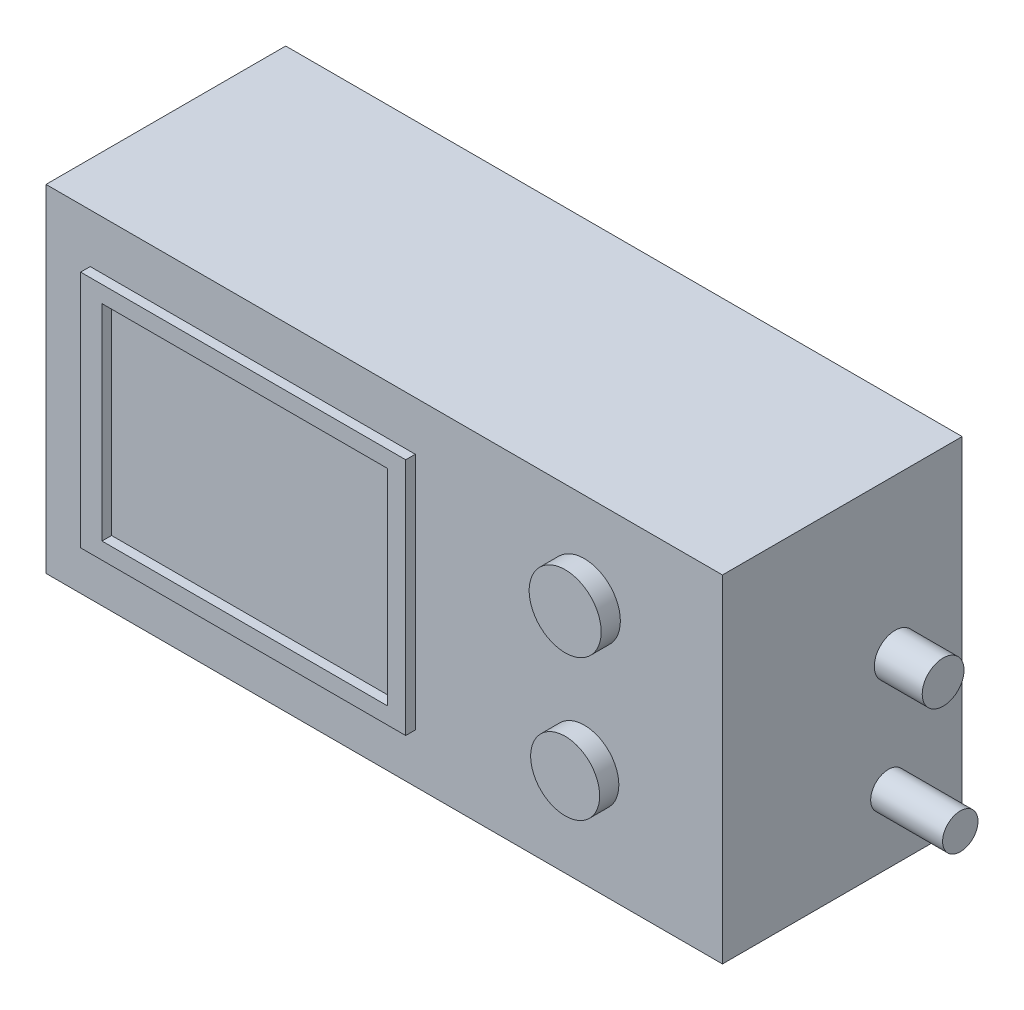
ISO-10303-21;
HEADER;
FILE_DESCRIPTION(('STEP AP214'),'2;1');
FILE_NAME('part.step','',(''),(''),'','','');
FILE_SCHEMA(('AUTOMOTIVE_DESIGN { 1 0 10303 214 1 1 1 1 }'));
ENDSEC;
DATA;
#1=APPLICATION_CONTEXT('core data for automotive mechanical design processes');
#2=APPLICATION_PROTOCOL_DEFINITION('international standard','automotive_design',2000,#1);
#3=PRODUCT_CONTEXT('',#1,'mechanical');
#4=PRODUCT('Part','Part','',(#3));
#5=PRODUCT_RELATED_PRODUCT_CATEGORY('part','',(#4));
#6=PRODUCT_DEFINITION_FORMATION('','',#4);
#7=PRODUCT_DEFINITION_CONTEXT('part definition',#1,'design');
#8=PRODUCT_DEFINITION('design','',#6,#7);
#9=PRODUCT_DEFINITION_SHAPE('','',#8);
#10=(LENGTH_UNIT() NAMED_UNIT(*) SI_UNIT(.MILLI.,.METRE.));
#11=(NAMED_UNIT(*) PLANE_ANGLE_UNIT() SI_UNIT($,.RADIAN.));
#12=(NAMED_UNIT(*) SI_UNIT($,.STERADIAN.) SOLID_ANGLE_UNIT());
#13=UNCERTAINTY_MEASURE_WITH_UNIT(LENGTH_MEASURE(1.E-05),#10,'distance_accuracy_value','');
#14=(GEOMETRIC_REPRESENTATION_CONTEXT(3) GLOBAL_UNCERTAINTY_ASSIGNED_CONTEXT((#13)) GLOBAL_UNIT_ASSIGNED_CONTEXT((#10,
#11,#12)) REPRESENTATION_CONTEXT('',''));
#15=CARTESIAN_POINT('',(0.,0.,0.));
#16=DIRECTION('',(0.,0.,1.));
#17=DIRECTION('',(1.,0.,0.));
#18=AXIS2_PLACEMENT_3D('',#15,#16,#17);
#19=CARTESIAN_POINT('',(0.,0.,50.));
#20=DIRECTION('',(0.,0.,1.));
#21=DIRECTION('',(1.,0.,0.));
#22=AXIS2_PLACEMENT_3D('',#19,#20,#21);
#23=PLANE('',#22);
#24=CARTESIAN_POINT('',(41.7432358237519,-13.5922837915246,50.));
#25=DIRECTION('',(0.,0.,1.));
#26=DIRECTION('',(1.,0.,0.));
#27=AXIS2_PLACEMENT_3D('',#24,#25,#26);
#28=CIRCLE('',#27,7.19474819268916);
#29=CARTESIAN_POINT('',(48.9379840164411,-13.5922837915246,50.));
#30=VERTEX_POINT('',#29);
#31=EDGE_CURVE('E449',#30,#30,#28,.T.);
#32=ORIENTED_EDGE('',*,*,#31,.F.);
#33=EDGE_LOOP('',(#32));
#34=FACE_BOUND('',#33,.T.);
#35=CARTESIAN_POINT('',(41.7432358237519,16.1796573708699,50.));
#36=DIRECTION('',(0.,0.,1.));
#37=DIRECTION('',(1.,0.,0.));
#38=AXIS2_PLACEMENT_3D('',#35,#36,#37);
#39=CIRCLE('',#38,7.50966636979589);
#40=CARTESIAN_POINT('',(49.2529021935478,16.1796573708699,50.));
#41=VERTEX_POINT('',#40);
#42=EDGE_CURVE('E455',#41,#41,#39,.T.);
#43=ORIENTED_EDGE('',*,*,#42,.F.);
#44=EDGE_LOOP('',(#43));
#45=FACE_BOUND('',#44,.T.);
#46=DIRECTION('',(0.,1.,0.));
#47=VECTOR('',#46,1.);
#48=CARTESIAN_POINT('',(70.552248215904,35.1395605691778,50.));
#49=LINE('',#48,#47);
#50=CARTESIAN_POINT('',(70.552248215904,-35.1395605691778,50.));
#51=VERTEX_POINT('',#50);
#52=CARTESIAN_POINT('',(70.552248215904,35.1395605691778,50.));
#53=VERTEX_POINT('',#52);
#54=EDGE_CURVE('E192',#51,#53,#49,.T.);
#55=ORIENTED_EDGE('',*,*,#54,.T.);
#56=DIRECTION('',(-1.,0.,0.));
#57=VECTOR('',#56,1.);
#58=CARTESIAN_POINT('',(-70.552248215904,35.1395605691778,50.));
#59=LINE('',#58,#57);
#60=CARTESIAN_POINT('',(-70.552248215904,35.1395605691778,50.));
#61=VERTEX_POINT('',#60);
#62=EDGE_CURVE('E195',#53,#61,#59,.T.);
#63=ORIENTED_EDGE('',*,*,#62,.T.);
#64=DIRECTION('',(0.,-1.,0.));
#65=VECTOR('',#64,1.);
#66=CARTESIAN_POINT('',(-70.552248215904,35.1395605691778,50.));
#67=LINE('',#66,#65);
#68=CARTESIAN_POINT('',(-70.552248215904,-35.1395605691778,50.));
#69=VERTEX_POINT('',#68);
#70=EDGE_CURVE('E198',#61,#69,#67,.T.);
#71=ORIENTED_EDGE('',*,*,#70,.T.);
#72=DIRECTION('',(1.,0.,0.));
#73=VECTOR('',#72,1.);
#74=CARTESIAN_POINT('',(-70.552248215904,-35.1395605691778,50.));
#75=LINE('',#74,#73);
#76=EDGE_CURVE('E200',#69,#51,#75,.T.);
#77=ORIENTED_EDGE('',*,*,#76,.T.);
#78=EDGE_LOOP('',(#55,#63,#71,#77));
#79=FACE_BOUND('',#78,.T.);
#80=DIRECTION('',(-1.,0.,0.));
#81=VECTOR('',#80,1.);
#82=CARTESIAN_POINT('',(-61.3307429758327,24.9076398150599,50.));
#83=LINE('',#82,#81);
#84=CARTESIAN_POINT('',(6.47482514606424,24.9076398150599,50.));
#85=VERTEX_POINT('',#84);
#86=CARTESIAN_POINT('',(-61.3307429758327,24.9076398150599,50.));
#87=VERTEX_POINT('',#86);
#88=EDGE_CURVE('E178',#85,#87,#83,.T.);
#89=ORIENTED_EDGE('',*,*,#88,.F.);
#90=DIRECTION('',(0.,1.,0.));
#91=VECTOR('',#90,1.);
#92=CARTESIAN_POINT('',(6.47482514606424,24.9076398150599,50.));
#93=LINE('',#92,#91);
#94=CARTESIAN_POINT('',(6.47482514606423,-24.9076398150599,50.));
#95=VERTEX_POINT('',#94);
#96=EDGE_CURVE('E141',#95,#85,#93,.T.);
#97=ORIENTED_EDGE('',*,*,#96,.F.);
#98=DIRECTION('',(1.,0.,0.));
#99=VECTOR('',#98,1.);
#100=CARTESIAN_POINT('',(-61.3307429758327,-24.9076398150599,50.));
#101=LINE('',#100,#99);
#102=CARTESIAN_POINT('',(-61.3307429758327,-24.9076398150599,50.));
#103=VERTEX_POINT('',#102);
#104=EDGE_CURVE('E169',#103,#95,#101,.T.);
#105=ORIENTED_EDGE('',*,*,#104,.F.);
#106=DIRECTION('',(0.,-1.,0.));
#107=VECTOR('',#106,1.);
#108=CARTESIAN_POINT('',(-61.3307429758327,24.9076398150599,50.));
#109=LINE('',#108,#107);
#110=EDGE_CURVE('E180',#87,#103,#109,.T.);
#111=ORIENTED_EDGE('',*,*,#110,.F.);
#112=EDGE_LOOP('',(#89,#97,#105,#111));
#113=FACE_BOUND('',#112,.T.);
#114=ADVANCED_FACE('F33',(#34,#45,#79,#113),#23,.T.);
#115=CARTESIAN_POINT('',(70.552248215904,35.1395605691778,50.));
#116=DIRECTION('',(-1.,0.,0.));
#117=DIRECTION('',(0.,0.,1.));
#118=AXIS2_PLACEMENT_3D('',#115,#116,#117);
#119=PLANE('',#118);
#120=CARTESIAN_POINT('',(70.552248215904,-20.9817019145522,15.3903178338375));
#121=DIRECTION('',(-1.,0.,0.));
#122=DIRECTION('',(0.,0.,1.));
#123=AXIS2_PLACEMENT_3D('',#120,#121,#122);
#124=CIRCLE('',#123,3.69367417620855);
#125=CARTESIAN_POINT('',(70.552248215904,-20.9817019145522,19.083992010046));
#126=VERTEX_POINT('',#125);
#127=EDGE_CURVE('E11',#126,#126,#124,.F.);
#128=ORIENTED_EDGE('',*,*,#127,.F.);
#129=EDGE_LOOP('',(#128));
#130=FACE_BOUND('',#129,.T.);
#131=CARTESIAN_POINT('',(70.552248215904,2.76951532955394,13.9697879538403));
#132=DIRECTION('',(-1.,0.,0.));
#133=DIRECTION('',(0.,0.,1.));
#134=AXIS2_PLACEMENT_3D('',#131,#132,#133);
#135=CIRCLE('',#134,4.36456916822436);
#136=CARTESIAN_POINT('',(70.552248215904,2.76951532955394,18.3343571220647));
#137=VERTEX_POINT('',#136);
#138=EDGE_CURVE('E41',#137,#137,#135,.F.);
#139=ORIENTED_EDGE('',*,*,#138,.F.);
#140=EDGE_LOOP('',(#139));
#141=FACE_BOUND('',#140,.T.);
#142=DIRECTION('',(0.,1.,0.));
#143=VECTOR('',#142,1.);
#144=CARTESIAN_POINT('',(70.552248215904,35.1395605691778,0.));
#145=LINE('',#144,#143);
#146=CARTESIAN_POINT('',(70.552248215904,-35.1395605691778,0.));
#147=VERTEX_POINT('',#146);
#148=CARTESIAN_POINT('',(70.552248215904,35.1395605691778,0.));
#149=VERTEX_POINT('',#148);
#150=EDGE_CURVE('E191',#147,#149,#145,.T.);
#151=ORIENTED_EDGE('',*,*,#150,.T.);
#152=DIRECTION('',(0.,0.,-1.));
#153=VECTOR('',#152,1.);
#154=CARTESIAN_POINT('',(70.552248215904,35.1395605691778,50.));
#155=LINE('',#154,#153);
#156=EDGE_CURVE('E218',#53,#149,#155,.T.);
#157=ORIENTED_EDGE('',*,*,#156,.F.);
#158=ORIENTED_EDGE('',*,*,#54,.F.);
#159=DIRECTION('',(0.,0.,-1.));
#160=VECTOR('',#159,1.);
#161=CARTESIAN_POINT('',(70.552248215904,-35.1395605691778,50.));
#162=LINE('',#161,#160);
#163=EDGE_CURVE('E202',#51,#147,#162,.T.);
#164=ORIENTED_EDGE('',*,*,#163,.T.);
#165=EDGE_LOOP('',(#151,#157,#158,#164));
#166=FACE_BOUND('',#165,.T.);
#167=ADVANCED_FACE('F35',(#130,#141,#166),#119,.F.);
#168=CARTESIAN_POINT('',(-70.552248215904,35.1395605691778,50.));
#169=DIRECTION('',(0.,-1.,0.));
#170=DIRECTION('',(0.,0.,-1.));
#171=AXIS2_PLACEMENT_3D('',#168,#169,#170);
#172=PLANE('',#171);
#173=DIRECTION('',(-1.,0.,0.));
#174=VECTOR('',#173,1.);
#175=CARTESIAN_POINT('',(-70.552248215904,35.1395605691778,0.));
#176=LINE('',#175,#174);
#177=CARTESIAN_POINT('',(-70.552248215904,35.1395605691778,0.));
#178=VERTEX_POINT('',#177);
#179=EDGE_CURVE('E205',#149,#178,#176,.T.);
#180=ORIENTED_EDGE('',*,*,#179,.T.);
#181=DIRECTION('',(0.,0.,-1.));
#182=VECTOR('',#181,1.);
#183=CARTESIAN_POINT('',(-70.552248215904,35.1395605691778,50.));
#184=LINE('',#183,#182);
#185=EDGE_CURVE('E215',#61,#178,#184,.T.);
#186=ORIENTED_EDGE('',*,*,#185,.F.);
#187=ORIENTED_EDGE('',*,*,#62,.F.);
#188=ORIENTED_EDGE('',*,*,#156,.T.);
#189=EDGE_LOOP('',(#180,#186,#187,#188));
#190=FACE_BOUND('',#189,.T.);
#191=ADVANCED_FACE('F227',(#190),#172,.F.);
#192=CARTESIAN_POINT('',(-70.552248215904,35.1395605691778,50.));
#193=DIRECTION('',(1.,0.,0.));
#194=DIRECTION('',(0.,0.,-1.));
#195=AXIS2_PLACEMENT_3D('',#192,#193,#194);
#196=PLANE('',#195);
#197=DIRECTION('',(0.,-1.,0.));
#198=VECTOR('',#197,1.);
#199=CARTESIAN_POINT('',(-70.552248215904,35.1395605691778,0.));
#200=LINE('',#199,#198);
#201=CARTESIAN_POINT('',(-70.552248215904,-35.1395605691778,0.));
#202=VERTEX_POINT('',#201);
#203=EDGE_CURVE('E207',#178,#202,#200,.T.);
#204=ORIENTED_EDGE('',*,*,#203,.T.);
#205=DIRECTION('',(0.,0.,-1.));
#206=VECTOR('',#205,1.);
#207=CARTESIAN_POINT('',(-70.552248215904,-35.1395605691778,50.));
#208=LINE('',#207,#206);
#209=EDGE_CURVE('E212',#69,#202,#208,.T.);
#210=ORIENTED_EDGE('',*,*,#209,.F.);
#211=ORIENTED_EDGE('',*,*,#70,.F.);
#212=ORIENTED_EDGE('',*,*,#185,.T.);
#213=EDGE_LOOP('',(#204,#210,#211,#212));
#214=FACE_BOUND('',#213,.T.);
#215=ADVANCED_FACE('F247',(#214),#196,.F.);
#216=CARTESIAN_POINT('',(-70.552248215904,-35.1395605691778,50.));
#217=DIRECTION('',(0.,1.,0.));
#218=DIRECTION('',(0.,0.,1.));
#219=AXIS2_PLACEMENT_3D('',#216,#217,#218);
#220=PLANE('',#219);
#221=DIRECTION('',(1.,0.,0.));
#222=VECTOR('',#221,1.);
#223=CARTESIAN_POINT('',(-70.552248215904,-35.1395605691778,0.));
#224=LINE('',#223,#222);
#225=EDGE_CURVE('E196',#202,#147,#224,.T.);
#226=ORIENTED_EDGE('',*,*,#225,.T.);
#227=ORIENTED_EDGE('',*,*,#163,.F.);
#228=ORIENTED_EDGE('',*,*,#76,.F.);
#229=ORIENTED_EDGE('',*,*,#209,.T.);
#230=EDGE_LOOP('',(#226,#227,#228,#229));
#231=FACE_BOUND('',#230,.T.);
#232=ADVANCED_FACE('F245',(#231),#220,.F.);
#233=CARTESIAN_POINT('',(0.,0.,0.));
#234=DIRECTION('',(0.,0.,1.));
#235=DIRECTION('',(1.,0.,0.));
#236=AXIS2_PLACEMENT_3D('',#233,#234,#235);
#237=PLANE('',#236);
#238=ORIENTED_EDGE('',*,*,#150,.F.);
#239=ORIENTED_EDGE('',*,*,#225,.F.);
#240=ORIENTED_EDGE('',*,*,#203,.F.);
#241=ORIENTED_EDGE('',*,*,#179,.F.);
#242=EDGE_LOOP('',(#238,#239,#240,#241));
#243=FACE_BOUND('',#242,.T.);
#244=ADVANCED_FACE('F235',(#243),#237,.F.);
#245=CARTESIAN_POINT('',(0.,0.,52.));
#246=DIRECTION('',(0.,0.,1.));
#247=DIRECTION('',(1.,0.,0.));
#248=AXIS2_PLACEMENT_3D('',#245,#246,#247);
#249=PLANE('',#248);
#250=DIRECTION('',(0.,1.,0.));
#251=VECTOR('',#250,1.);
#252=CARTESIAN_POINT('',(6.47482514606424,24.9076398150599,52.));
#253=LINE('',#252,#251);
#254=CARTESIAN_POINT('',(6.47482514606423,-24.9076398150599,52.));
#255=VERTEX_POINT('',#254);
#256=CARTESIAN_POINT('',(6.47482514606424,24.9076398150599,52.));
#257=VERTEX_POINT('',#256);
#258=EDGE_CURVE('E165',#255,#257,#253,.T.);
#259=ORIENTED_EDGE('',*,*,#258,.T.);
#260=DIRECTION('',(-1.,0.,0.));
#261=VECTOR('',#260,1.);
#262=CARTESIAN_POINT('',(-61.3307429758327,24.9076398150599,52.));
#263=LINE('',#262,#261);
#264=CARTESIAN_POINT('',(-61.3307429758327,24.9076398150599,52.));
#265=VERTEX_POINT('',#264);
#266=EDGE_CURVE('E168',#257,#265,#263,.T.);
#267=ORIENTED_EDGE('',*,*,#266,.T.);
#268=DIRECTION('',(0.,-1.,0.));
#269=VECTOR('',#268,1.);
#270=CARTESIAN_POINT('',(-61.3307429758327,24.9076398150599,52.));
#271=LINE('',#270,#269);
#272=CARTESIAN_POINT('',(-61.3307429758327,-24.9076398150599,52.));
#273=VERTEX_POINT('',#272);
#274=EDGE_CURVE('E171',#265,#273,#271,.T.);
#275=ORIENTED_EDGE('',*,*,#274,.T.);
#276=DIRECTION('',(1.,0.,0.));
#277=VECTOR('',#276,1.);
#278=CARTESIAN_POINT('',(-61.3307429758327,-24.9076398150599,52.));
#279=LINE('',#278,#277);
#280=EDGE_CURVE('E173',#273,#255,#279,.T.);
#281=ORIENTED_EDGE('',*,*,#280,.T.);
#282=EDGE_LOOP('',(#259,#267,#275,#281));
#283=FACE_BOUND('',#282,.T.);
#284=DIRECTION('',(-1.,0.,0.));
#285=VECTOR('',#284,1.);
#286=CARTESIAN_POINT('',(-56.8743135997209,21.4471433925496,52.));
#287=LINE('',#286,#285);
#288=CARTESIAN_POINT('',(2.718580593708,21.4471433925496,52.));
#289=VERTEX_POINT('',#288);
#290=CARTESIAN_POINT('',(-56.8743135997209,21.4471433925496,52.));
#291=VERTEX_POINT('',#290);
#292=EDGE_CURVE('E133',#289,#291,#287,.T.);
#293=ORIENTED_EDGE('',*,*,#292,.F.);
#294=DIRECTION('',(0.,1.,0.));
#295=VECTOR('',#294,1.);
#296=CARTESIAN_POINT('',(2.718580593708,21.4471433925496,52.));
#297=LINE('',#296,#295);
#298=CARTESIAN_POINT('',(2.718580593708,-21.4471433925496,52.));
#299=VERTEX_POINT('',#298);
#300=EDGE_CURVE('E124',#299,#289,#297,.T.);
#301=ORIENTED_EDGE('',*,*,#300,.F.);
#302=DIRECTION('',(1.,0.,0.));
#303=VECTOR('',#302,1.);
#304=CARTESIAN_POINT('',(-56.8743135997209,-21.4471433925496,52.));
#305=LINE('',#304,#303);
#306=CARTESIAN_POINT('',(-56.8743135997209,-21.4471433925496,52.));
#307=VERTEX_POINT('',#306);
#308=EDGE_CURVE('E149',#307,#299,#305,.T.);
#309=ORIENTED_EDGE('',*,*,#308,.F.);
#310=DIRECTION('',(0.,-1.,0.));
#311=VECTOR('',#310,1.);
#312=CARTESIAN_POINT('',(-56.8743135997209,21.4471433925496,52.));
#313=LINE('',#312,#311);
#314=EDGE_CURVE('E147',#291,#307,#313,.T.);
#315=ORIENTED_EDGE('',*,*,#314,.F.);
#316=EDGE_LOOP('',(#293,#301,#309,#315));
#317=FACE_BOUND('',#316,.T.);
#318=ADVANCED_FACE('F145',(#283,#317),#249,.T.);
#319=CARTESIAN_POINT('',(6.47482514606424,24.9076398150599,52.));
#320=DIRECTION('',(-1.,0.,0.));
#321=DIRECTION('',(0.,-1.,0.));
#322=AXIS2_PLACEMENT_3D('',#319,#320,#321);
#323=PLANE('',#322);
#324=ORIENTED_EDGE('',*,*,#96,.T.);
#325=DIRECTION('',(0.,0.,-1.));
#326=VECTOR('',#325,1.);
#327=CARTESIAN_POINT('',(6.47482514606424,24.9076398150599,52.));
#328=LINE('',#327,#326);
#329=EDGE_CURVE('E189',#257,#85,#328,.T.);
#330=ORIENTED_EDGE('',*,*,#329,.F.);
#331=ORIENTED_EDGE('',*,*,#258,.F.);
#332=DIRECTION('',(0.,0.,-1.));
#333=VECTOR('',#332,1.);
#334=CARTESIAN_POINT('',(6.47482514606423,-24.9076398150599,52.));
#335=LINE('',#334,#333);
#336=EDGE_CURVE('E175',#255,#95,#335,.T.);
#337=ORIENTED_EDGE('',*,*,#336,.T.);
#338=EDGE_LOOP('',(#324,#330,#331,#337));
#339=FACE_BOUND('',#338,.T.);
#340=ADVANCED_FACE('F293',(#339),#323,.F.);
#341=CARTESIAN_POINT('',(-61.3307429758327,24.9076398150599,52.));
#342=DIRECTION('',(0.,-1.,0.));
#343=DIRECTION('',(0.,0.,-1.));
#344=AXIS2_PLACEMENT_3D('',#341,#342,#343);
#345=PLANE('',#344);
#346=ORIENTED_EDGE('',*,*,#88,.T.);
#347=DIRECTION('',(0.,0.,-1.));
#348=VECTOR('',#347,1.);
#349=CARTESIAN_POINT('',(-61.3307429758327,24.9076398150599,52.));
#350=LINE('',#349,#348);
#351=EDGE_CURVE('E186',#265,#87,#350,.T.);
#352=ORIENTED_EDGE('',*,*,#351,.F.);
#353=ORIENTED_EDGE('',*,*,#266,.F.);
#354=ORIENTED_EDGE('',*,*,#329,.T.);
#355=EDGE_LOOP('',(#346,#352,#353,#354));
#356=FACE_BOUND('',#355,.T.);
#357=ADVANCED_FACE('F300',(#356),#345,.F.);
#358=CARTESIAN_POINT('',(-61.3307429758327,24.9076398150599,52.));
#359=DIRECTION('',(1.,0.,0.));
#360=DIRECTION('',(0.,1.,0.));
#361=AXIS2_PLACEMENT_3D('',#358,#359,#360);
#362=PLANE('',#361);
#363=ORIENTED_EDGE('',*,*,#110,.T.);
#364=DIRECTION('',(0.,0.,-1.));
#365=VECTOR('',#364,1.);
#366=CARTESIAN_POINT('',(-61.3307429758327,-24.9076398150599,52.));
#367=LINE('',#366,#365);
#368=EDGE_CURVE('E48',#273,#103,#367,.T.);
#369=ORIENTED_EDGE('',*,*,#368,.F.);
#370=ORIENTED_EDGE('',*,*,#274,.F.);
#371=ORIENTED_EDGE('',*,*,#351,.T.);
#372=EDGE_LOOP('',(#363,#369,#370,#371));
#373=FACE_BOUND('',#372,.T.);
#374=ADVANCED_FACE('F297',(#373),#362,.F.);
#375=CARTESIAN_POINT('',(-61.3307429758327,-24.9076398150599,52.));
#376=DIRECTION('',(0.,1.,0.));
#377=DIRECTION('',(-1.,0.,0.));
#378=AXIS2_PLACEMENT_3D('',#375,#376,#377);
#379=PLANE('',#378);
#380=ORIENTED_EDGE('',*,*,#104,.T.);
#381=ORIENTED_EDGE('',*,*,#336,.F.);
#382=ORIENTED_EDGE('',*,*,#280,.F.);
#383=ORIENTED_EDGE('',*,*,#368,.T.);
#384=EDGE_LOOP('',(#380,#381,#382,#383));
#385=FACE_BOUND('',#384,.T.);
#386=ADVANCED_FACE('F290',(#385),#379,.F.);
#387=CARTESIAN_POINT('',(2.718580593708,21.4471433925496,52.));
#388=DIRECTION('',(-1.,0.,0.));
#389=DIRECTION('',(0.,-1.,0.));
#390=AXIS2_PLACEMENT_3D('',#387,#388,#389);
#391=PLANE('',#390);
#392=DIRECTION('',(0.,1.,0.));
#393=VECTOR('',#392,1.);
#394=CARTESIAN_POINT('',(2.718580593708,21.4471433925496,50.));
#395=LINE('',#394,#393);
#396=CARTESIAN_POINT('',(2.718580593708,-21.4471433925496,50.));
#397=VERTEX_POINT('',#396);
#398=CARTESIAN_POINT('',(2.718580593708,21.4471433925496,50.));
#399=VERTEX_POINT('',#398);
#400=EDGE_CURVE('E56',#397,#399,#395,.T.);
#401=ORIENTED_EDGE('',*,*,#400,.F.);
#402=DIRECTION('',(0.,0.,-1.));
#403=VECTOR('',#402,1.);
#404=CARTESIAN_POINT('',(2.718580593708,-21.4471433925496,52.));
#405=LINE('',#404,#403);
#406=EDGE_CURVE('E129',#299,#397,#405,.T.);
#407=ORIENTED_EDGE('',*,*,#406,.F.);
#408=ORIENTED_EDGE('',*,*,#300,.T.);
#409=DIRECTION('',(0.,0.,-1.));
#410=VECTOR('',#409,1.);
#411=CARTESIAN_POINT('',(2.718580593708,21.4471433925496,52.));
#412=LINE('',#411,#410);
#413=EDGE_CURVE('E127',#289,#399,#412,.T.);
#414=ORIENTED_EDGE('',*,*,#413,.T.);
#415=EDGE_LOOP('',(#401,#407,#408,#414));
#416=FACE_BOUND('',#415,.T.);
#417=ADVANCED_FACE('F126',(#416),#391,.T.);
#418=CARTESIAN_POINT('',(-56.8743135997209,21.4471433925496,52.));
#419=DIRECTION('',(0.,-1.,0.));
#420=DIRECTION('',(0.,0.,-1.));
#421=AXIS2_PLACEMENT_3D('',#418,#419,#420);
#422=PLANE('',#421);
#423=DIRECTION('',(-1.,0.,0.));
#424=VECTOR('',#423,1.);
#425=CARTESIAN_POINT('',(-56.8743135997209,21.4471433925496,50.));
#426=LINE('',#425,#424);
#427=CARTESIAN_POINT('',(-56.874313599721,21.4471433925496,50.));
#428=VERTEX_POINT('',#427);
#429=EDGE_CURVE('E140',#399,#428,#426,.T.);
#430=ORIENTED_EDGE('',*,*,#429,.F.);
#431=ORIENTED_EDGE('',*,*,#413,.F.);
#432=ORIENTED_EDGE('',*,*,#292,.T.);
#433=DIRECTION('',(0.,0.,-1.));
#434=VECTOR('',#433,1.);
#435=CARTESIAN_POINT('',(-56.8743135997209,21.4471433925496,52.));
#436=LINE('',#435,#434);
#437=EDGE_CURVE('E142',#291,#428,#436,.T.);
#438=ORIENTED_EDGE('',*,*,#437,.T.);
#439=EDGE_LOOP('',(#430,#431,#432,#438));
#440=FACE_BOUND('',#439,.T.);
#441=ADVANCED_FACE('F137',(#440),#422,.T.);
#442=CARTESIAN_POINT('',(-56.8743135997209,21.4471433925496,52.));
#443=DIRECTION('',(1.,0.,0.));
#444=DIRECTION('',(0.,1.,0.));
#445=AXIS2_PLACEMENT_3D('',#442,#443,#444);
#446=PLANE('',#445);
#447=DIRECTION('',(0.,-1.,0.));
#448=VECTOR('',#447,1.);
#449=CARTESIAN_POINT('',(-56.8743135997209,21.4471433925496,50.));
#450=LINE('',#449,#448);
#451=CARTESIAN_POINT('',(-56.8743135997209,-21.4471433925496,50.));
#452=VERTEX_POINT('',#451);
#453=EDGE_CURVE('E157',#428,#452,#450,.T.);
#454=ORIENTED_EDGE('',*,*,#453,.F.);
#455=ORIENTED_EDGE('',*,*,#437,.F.);
#456=ORIENTED_EDGE('',*,*,#314,.T.);
#457=DIRECTION('',(0.,0.,-1.));
#458=VECTOR('',#457,1.);
#459=CARTESIAN_POINT('',(-56.8743135997209,-21.4471433925496,52.));
#460=LINE('',#459,#458);
#461=EDGE_CURVE('E161',#307,#452,#460,.T.);
#462=ORIENTED_EDGE('',*,*,#461,.T.);
#463=EDGE_LOOP('',(#454,#455,#456,#462));
#464=FACE_BOUND('',#463,.T.);
#465=ADVANCED_FACE('F275',(#464),#446,.T.);
#466=CARTESIAN_POINT('',(-56.8743135997209,-21.4471433925496,52.));
#467=DIRECTION('',(0.,1.,0.));
#468=DIRECTION('',(0.,0.,1.));
#469=AXIS2_PLACEMENT_3D('',#466,#467,#468);
#470=PLANE('',#469);
#471=DIRECTION('',(1.,0.,0.));
#472=VECTOR('',#471,1.);
#473=CARTESIAN_POINT('',(-56.8743135997209,-21.4471433925496,50.));
#474=LINE('',#473,#472);
#475=EDGE_CURVE('E134',#452,#397,#474,.T.);
#476=ORIENTED_EDGE('',*,*,#475,.F.);
#477=ORIENTED_EDGE('',*,*,#461,.F.);
#478=ORIENTED_EDGE('',*,*,#308,.T.);
#479=ORIENTED_EDGE('',*,*,#406,.T.);
#480=EDGE_LOOP('',(#476,#477,#478,#479));
#481=FACE_BOUND('',#480,.T.);
#482=ADVANCED_FACE('F267',(#481),#470,.T.);
#483=ORIENTED_EDGE('',*,*,#400,.T.);
#484=ORIENTED_EDGE('',*,*,#429,.T.);
#485=ORIENTED_EDGE('',*,*,#453,.T.);
#486=ORIENTED_EDGE('',*,*,#475,.T.);
#487=EDGE_LOOP('',(#483,#484,#485,#486));
#488=FACE_BOUND('',#487,.T.);
#489=ADVANCED_FACE('F258',(#488),#23,.T.);
#490=CARTESIAN_POINT('',(41.7432358237519,16.1796573708699,54.));
#491=DIRECTION('',(0.,0.,-1.));
#492=DIRECTION('',(-1.,0.,0.));
#493=AXIS2_PLACEMENT_3D('',#490,#491,#492);
#494=CYLINDRICAL_SURFACE('',#493,7.50966636979589);
#495=CARTESIAN_POINT('',(41.7432358237519,16.1796573708699,54.));
#496=DIRECTION('',(0.,0.,1.));
#497=DIRECTION('',(1.,0.,0.));
#498=AXIS2_PLACEMENT_3D('',#495,#496,#497);
#499=CIRCLE('',#498,7.50966636979589);
#500=CARTESIAN_POINT('',(49.2529021935478,16.1796573708699,54.));
#501=VERTEX_POINT('',#500);
#502=EDGE_CURVE('E155',#501,#501,#499,.T.);
#503=ORIENTED_EDGE('',*,*,#502,.F.);
#504=EDGE_LOOP('',(#503));
#505=FACE_BOUND('',#504,.T.);
#506=ORIENTED_EDGE('',*,*,#42,.T.);
#507=EDGE_LOOP('',(#506));
#508=FACE_BOUND('',#507,.T.);
#509=ADVANCED_FACE('F266',(#505,#508),#494,.T.);
#510=CARTESIAN_POINT('',(41.7432358237519,16.1796573708699,54.));
#511=DIRECTION('',(0.,0.,1.));
#512=DIRECTION('',(1.,0.,0.));
#513=AXIS2_PLACEMENT_3D('',#510,#511,#512);
#514=PLANE('',#513);
#515=ORIENTED_EDGE('',*,*,#502,.T.);
#516=EDGE_LOOP('',(#515));
#517=FACE_BOUND('',#516,.T.);
#518=ADVANCED_FACE('F272',(#517),#514,.T.);
#519=CARTESIAN_POINT('',(41.7432358237519,-13.5922837915246,54.));
#520=DIRECTION('',(0.,0.,-1.));
#521=DIRECTION('',(-1.,0.,0.));
#522=AXIS2_PLACEMENT_3D('',#519,#520,#521);
#523=CYLINDRICAL_SURFACE('',#522,7.19474819268916);
#524=CARTESIAN_POINT('',(41.7432358237519,-13.5922837915246,54.));
#525=DIRECTION('',(0.,0.,1.));
#526=DIRECTION('',(1.,0.,0.));
#527=AXIS2_PLACEMENT_3D('',#524,#525,#526);
#528=CIRCLE('',#527,7.19474819268916);
#529=CARTESIAN_POINT('',(48.9379840164411,-13.5922837915246,54.));
#530=VERTEX_POINT('',#529);
#531=EDGE_CURVE('E452',#530,#530,#528,.T.);
#532=ORIENTED_EDGE('',*,*,#531,.F.);
#533=EDGE_LOOP('',(#532));
#534=FACE_BOUND('',#533,.T.);
#535=ORIENTED_EDGE('',*,*,#31,.T.);
#536=EDGE_LOOP('',(#535));
#537=FACE_BOUND('',#536,.T.);
#538=ADVANCED_FACE('F374',(#534,#537),#523,.T.);
#539=CARTESIAN_POINT('',(41.7432358237519,-13.5922837915246,54.));
#540=DIRECTION('',(0.,0.,1.));
#541=DIRECTION('',(1.,0.,0.));
#542=AXIS2_PLACEMENT_3D('',#539,#540,#541);
#543=PLANE('',#542);
#544=ORIENTED_EDGE('',*,*,#531,.T.);
#545=EDGE_LOOP('',(#544));
#546=FACE_BOUND('',#545,.T.);
#547=ADVANCED_FACE('F383',(#546),#543,.T.);
#548=CARTESIAN_POINT('',(80.552248215904,2.76951532955394,13.9697879538403));
#549=DIRECTION('',(-1.,0.,0.));
#550=DIRECTION('',(0.,0.,1.));
#551=AXIS2_PLACEMENT_3D('',#548,#549,#550);
#552=CYLINDRICAL_SURFACE('',#551,4.36456916822436);
#553=CARTESIAN_POINT('',(80.552248215904,2.76951532955394,13.9697879538403));
#554=DIRECTION('',(1.,0.,0.));
#555=DIRECTION('',(0.,0.,-1.));
#556=AXIS2_PLACEMENT_3D('',#553,#554,#555);
#557=CIRCLE('',#556,4.36456916822436);
#558=CARTESIAN_POINT('',(80.552248215904,2.76951532955394,9.60521878561593));
#559=VERTEX_POINT('',#558);
#560=EDGE_CURVE('E446',#559,#559,#557,.T.);
#561=ORIENTED_EDGE('',*,*,#560,.F.);
#562=EDGE_LOOP('',(#561));
#563=FACE_BOUND('',#562,.T.);
#564=ORIENTED_EDGE('',*,*,#138,.T.);
#565=EDGE_LOOP('',(#564));
#566=FACE_BOUND('',#565,.T.);
#567=ADVANCED_FACE('F223',(#563,#566),#552,.T.);
#568=CARTESIAN_POINT('',(80.552248215904,2.76951532955394,13.9697879538403));
#569=DIRECTION('',(1.,0.,0.));
#570=DIRECTION('',(0.,0.,-1.));
#571=AXIS2_PLACEMENT_3D('',#568,#569,#570);
#572=PLANE('',#571);
#573=ORIENTED_EDGE('',*,*,#560,.T.);
#574=EDGE_LOOP('',(#573));
#575=FACE_BOUND('',#574,.T.);
#576=ADVANCED_FACE('F402',(#575),#572,.T.);
#577=CARTESIAN_POINT('',(85.552248215904,-20.9817019145522,15.3903178338375));
#578=DIRECTION('',(-1.,0.,0.));
#579=DIRECTION('',(0.,0.,1.));
#580=AXIS2_PLACEMENT_3D('',#577,#578,#579);
#581=CYLINDRICAL_SURFACE('',#580,3.69367417620855);
#582=CARTESIAN_POINT('',(85.552248215904,-20.9817019145522,15.3903178338375));
#583=DIRECTION('',(1.,0.,0.));
#584=DIRECTION('',(0.,0.,-1.));
#585=AXIS2_PLACEMENT_3D('',#582,#583,#584);
#586=CIRCLE('',#585,3.69367417620855);
#587=CARTESIAN_POINT('',(85.552248215904,-20.9817019145522,11.6966436576289));
#588=VERTEX_POINT('',#587);
#589=EDGE_CURVE('E445',#588,#588,#586,.T.);
#590=ORIENTED_EDGE('',*,*,#589,.F.);
#591=EDGE_LOOP('',(#590));
#592=FACE_BOUND('',#591,.T.);
#593=ORIENTED_EDGE('',*,*,#127,.T.);
#594=EDGE_LOOP('',(#593));
#595=FACE_BOUND('',#594,.T.);
#596=ADVANCED_FACE('F412',(#592,#595),#581,.T.);
#597=CARTESIAN_POINT('',(85.552248215904,-20.9817019145522,15.3903178338375));
#598=DIRECTION('',(1.,0.,0.));
#599=DIRECTION('',(0.,0.,-1.));
#600=AXIS2_PLACEMENT_3D('',#597,#598,#599);
#601=PLANE('',#600);
#602=ORIENTED_EDGE('',*,*,#589,.T.);
#603=EDGE_LOOP('',(#602));
#604=FACE_BOUND('',#603,.T.);
#605=ADVANCED_FACE('F429',(#604),#601,.T.);
#606=CLOSED_SHELL('',(#114,#167,#191,#215,#232,#244,#318,#340,#357,#374,#386,#417,#441,#465,
#482,#489,#509,#518,#538,#547,#567,#576,#596,#605));
#607=MANIFOLD_SOLID_BREP('B2',#606);
#608=ADVANCED_BREP_SHAPE_REPRESENTATION('',(#18,#607),#14);
#609=SHAPE_DEFINITION_REPRESENTATION(#9,#608);
ENDSEC;
END-ISO-10303-21;
